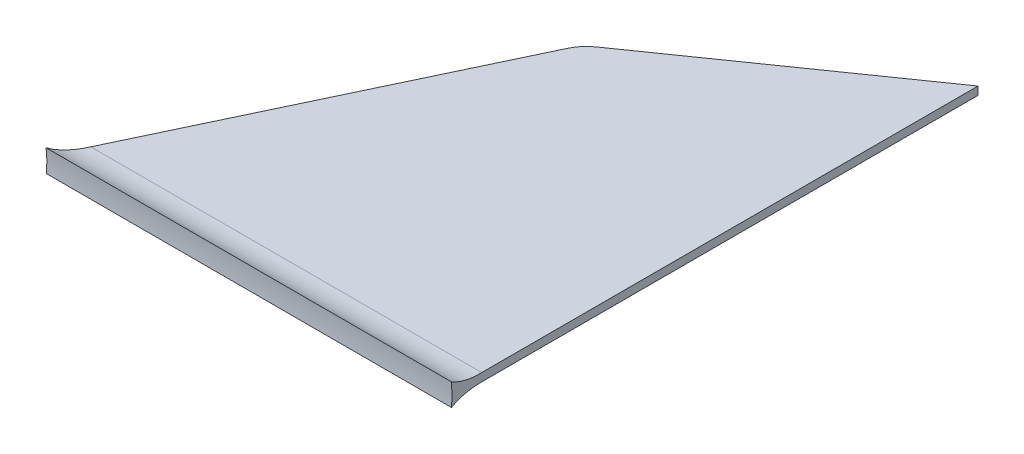
ISO-10303-21;
HEADER;
FILE_DESCRIPTION(('STEP AP214'),'2;1');
FILE_NAME('part.step','',(''),(''),'','','');
FILE_SCHEMA(('AUTOMOTIVE_DESIGN { 1 0 10303 214 1 1 1 1 }'));
ENDSEC;
DATA;
#1=APPLICATION_CONTEXT('core data for automotive mechanical design processes');
#2=APPLICATION_PROTOCOL_DEFINITION('international standard','automotive_design',2000,#1);
#3=PRODUCT_CONTEXT('',#1,'mechanical');
#4=PRODUCT('Part','Part','',(#3));
#5=PRODUCT_RELATED_PRODUCT_CATEGORY('part','',(#4));
#6=PRODUCT_DEFINITION_FORMATION('','',#4);
#7=PRODUCT_DEFINITION_CONTEXT('part definition',#1,'design');
#8=PRODUCT_DEFINITION('design','',#6,#7);
#9=PRODUCT_DEFINITION_SHAPE('','',#8);
#10=(LENGTH_UNIT() NAMED_UNIT(*) SI_UNIT(.MILLI.,.METRE.));
#11=(NAMED_UNIT(*) PLANE_ANGLE_UNIT() SI_UNIT($,.RADIAN.));
#12=(NAMED_UNIT(*) SI_UNIT($,.STERADIAN.) SOLID_ANGLE_UNIT());
#13=UNCERTAINTY_MEASURE_WITH_UNIT(LENGTH_MEASURE(1.E-05),#10,'distance_accuracy_value','');
#14=(GEOMETRIC_REPRESENTATION_CONTEXT(3) GLOBAL_UNCERTAINTY_ASSIGNED_CONTEXT((#13)) GLOBAL_UNIT_ASSIGNED_CONTEXT((#10,
#11,#12)) REPRESENTATION_CONTEXT('',''));
#15=CARTESIAN_POINT('',(0.,0.,0.));
#16=DIRECTION('',(0.,0.,1.));
#17=DIRECTION('',(1.,0.,0.));
#18=AXIS2_PLACEMENT_3D('',#15,#16,#17);
#19=CARTESIAN_POINT('',(42.5645026995307,2.,-90.));
#20=DIRECTION('',(0.903998327362129,0.,0.427535991615295));
#21=DIRECTION('',(0.427535991615295,0.,-0.903998327362129));
#22=AXIS2_PLACEMENT_3D('',#19,#20,#21);
#23=PLANE('',#22);
#24=CARTESIAN_POINT('',(3.71067552900517,0.,-7.84599317341836));
#25=CARTESIAN_POINT('',(3.58531579273385,0.000491797219638323,-7.58092778914586));
#26=CARTESIAN_POINT('',(3.45993831009392,-0.00371603010727385,-7.31582488127802));
#27=CARTESIAN_POINT('',(3.20926904675037,-0.0224615016140238,-6.78580027696923));
#28=CARTESIAN_POINT('',(3.08397733224158,-0.0370039090424223,-6.52087872049313));
#29=CARTESIAN_POINT('',(2.83320367344459,-0.077433994677133,-5.99063337847535));
#30=CARTESIAN_POINT('',(2.70772305573708,-0.103367948984552,-5.72531239790624));
#31=CARTESIAN_POINT('',(2.45736525560459,-0.167622663346544,-5.19594636323217));
#32=CARTESIAN_POINT('',(2.3324879698077,-0.205941219144582,-4.93190109055373));
#33=CARTESIAN_POINT('',(2.01796747780127,-0.319834051708501,-4.26686702495216));
#34=CARTESIAN_POINT('',(1.82889832085237,-0.404398807426178,-3.86709202357315));
#35=CARTESIAN_POINT('',(1.45463070635677,-0.608897428913534,-3.07572637453962));
#36=CARTESIAN_POINT('',(1.26942486126138,-0.728755566111489,-2.68412010637171));
#37=CARTESIAN_POINT('',(0.992767919870458,-0.940253450792282,-2.09914616926385));
#38=CARTESIAN_POINT('',(0.899284357542949,-1.01751526135691,-1.90148097700569));
#39=CARTESIAN_POINT('',(0.714101480557676,-1.18296514248587,-1.50992327348157));
#40=CARTESIAN_POINT('',(0.62240198971404,-1.27115212773291,-1.31603038968151));
#41=CARTESIAN_POINT('',(0.440748373266573,-1.4592428935537,-0.931935088588017));
#42=CARTESIAN_POINT('',(0.350803451614786,-1.55919544029076,-0.741752132480111));
#43=CARTESIAN_POINT('',(0.173416749875057,-1.77078282584916,-0.366678957790928));
#44=CARTESIAN_POINT('',(0.0859760312647441,-1.88242252792542,-0.181790983638237));
#45=CARTESIAN_POINT('',(0.,-2.,4.12687892662174E-13));
#46=B_SPLINE_CURVE_WITH_KNOTS('',3,(#24,#25,#26,#27,#28,#29,#30,#31,#32,#33,#34,#35,#36,#37,#38,
#39,#40,#41,#42,#43,#44,#45),.UNSPECIFIED.,.F.,.F.,(4,2,2,2,2,2,2,2,2,2,4),(0.,
0.879655941993665,1.75971758403859,2.6433878667751,3.52690095718426,4.87633772662082,
6.22289986694779,6.91836816277328,7.61376742543035,8.31215782638697,9.01084000525956),.UNSPECIFIED.);
#47=CARTESIAN_POINT('',(3.71067552900535,0.,-7.84599317341873));
#48=VERTEX_POINT('',#47);
#49=CARTESIAN_POINT('',(0.191540032990975,-1.75073870850016,-0.404999515461942));
#50=VERTEX_POINT('',#49);
#51=EDGE_CURVE('E126',#48,#50,#46,.T.);
#52=ORIENTED_EDGE('',*,*,#51,.T.);
#53=CARTESIAN_POINT('',(-15.1340454042778,0.732405750222965,32.0000000000004));
#54=DIRECTION('',(0.903998327362129,0.,0.427535991615295));
#55=DIRECTION('',(0.427535991615295,0.,-0.903998327362129));
#56=AXIS2_PLACEMENT_3D('',#53,#54,#55);
#57=ELLIPSE('',#56,35.9513939531672,32.5);
#58=CARTESIAN_POINT('',(0.169119053862443,3.77152673900595,-0.357591746227265));
#59=VERTEX_POINT('',#58);
#60=EDGE_CURVE('E56',#50,#59,#57,.T.);
#61=ORIENTED_EDGE('',*,*,#60,.T.);
#62=CARTESIAN_POINT('',(0.,3.99999999999989,2.02685613397344E-13));
#63=CARTESIAN_POINT('',(0.072365649543443,3.8978537676301,-0.15301267595873));
#64=CARTESIAN_POINT('',(0.14582180623743,3.79996478912292,-0.308331161625739));
#65=CARTESIAN_POINT('',(0.294671995230013,3.61269899906039,-0.623065650688167));
#66=CARTESIAN_POINT('',(0.370065606938458,3.52332035954275,-0.782480764771805));
#67=CARTESIAN_POINT('',(0.522317258909682,3.35332110937263,-1.1044074362553));
#68=CARTESIAN_POINT('',(0.599169386549027,3.27267149938144,-1.26690649177976));
#69=CARTESIAN_POINT('',(0.754363481256821,3.11965425216449,-1.59505477586288));
#70=CARTESIAN_POINT('',(0.83270552500456,3.04728704254913,-1.76070416655512));
#71=CARTESIAN_POINT('',(1.0694951200567,2.8424797659571,-2.26138107343994));
#72=CARTESIAN_POINT('',(1.22988127771266,2.7221403472804,-2.60050765248008));
#73=CARTESIAN_POINT('',(1.5545203403159,2.51155242773646,-3.28693680779158));
#74=CARTESIAN_POINT('',(1.7187805657151,2.42136676436771,-3.6342548627043));
#75=CARTESIAN_POINT('',(2.03459013466153,2.27573189552543,-4.30201460151342));
#76=CARTESIAN_POINT('',(2.18593930240007,2.21787210638783,-4.62203302608246));
#77=CARTESIAN_POINT('',(2.48989394983943,2.12306935183539,-5.26472626891561));
#78=CARTESIAN_POINT('',(2.6425000370788,2.08613718688418,-5.58740237178231));
#79=CARTESIAN_POINT('',(2.94770674656241,2.03132636599851,-6.23274302212256));
#80=CARTESIAN_POINT('',(3.10030498932871,2.01337271250511,-6.55540253833766));
#81=CARTESIAN_POINT('',(3.40552719250608,1.99444150434674,-7.20077594913203));
#82=CARTESIAN_POINT('',(3.55815092827247,1.99344475623463,-7.52348936871409));
#83=CARTESIAN_POINT('',(3.71067552900517,2.,-7.84599317341836));
#84=B_SPLINE_CURVE_WITH_KNOTS('',3,(#62,#63,#64,#65,#66,#67,#68,#69,#70,#71,#72,#73,#74,#75,#76,
#77,#78,#79,#80,#81,#82,#83),.UNSPECIFIED.,.F.,.F.,(4,2,2,2,2,2,2,2,2,2,4),(0.,
0.593000748492561,1.18587383580466,1.77671258005781,2.36758181485853,3.54796573318053,
4.73079434494676,5.8062181489395,6.88219646029566,7.95390673886503,9.02440387243802),.UNSPECIFIED.);
#85=CARTESIAN_POINT('',(3.71067552900533,2.,-7.84599317341836));
#86=VERTEX_POINT('',#85);
#87=EDGE_CURVE('E42',#59,#86,#84,.T.);
#88=ORIENTED_EDGE('',*,*,#87,.T.);
#89=DIRECTION('',(-0.427535991615295,0.,0.903998327362129));
#90=VECTOR('',#89,1.);
#91=CARTESIAN_POINT('',(42.5645026995307,2.,-90.));
#92=LINE('',#91,#90);
#93=CARTESIAN_POINT('',(41.4290446959055,2.,-87.5991445019891));
#94=VERTEX_POINT('',#93);
#95=EDGE_CURVE('E202',#94,#86,#92,.T.);
#96=ORIENTED_EDGE('',*,*,#95,.F.);
#97=DIRECTION('',(0.,-1.,0.));
#98=VECTOR('',#97,1.);
#99=CARTESIAN_POINT('',(41.4290446959055,2.,-87.5991445019891));
#100=LINE('',#99,#98);
#101=CARTESIAN_POINT('',(41.4290446959055,0.,-87.5991445019891));
#102=VERTEX_POINT('',#101);
#103=EDGE_CURVE('E211',#94,#102,#100,.T.);
#104=ORIENTED_EDGE('',*,*,#103,.T.);
#105=DIRECTION('',(-0.427535991615295,0.,0.903998327362129));
#106=VECTOR('',#105,1.);
#107=CARTESIAN_POINT('',(42.5645026995307,0.,-90.));
#108=LINE('',#107,#106);
#109=EDGE_CURVE('E198',#102,#48,#108,.T.);
#110=ORIENTED_EDGE('',*,*,#109,.T.);
#111=EDGE_LOOP('',(#52,#61,#88,#96,#104,#110));
#112=FACE_BOUND('',#111,.T.);
#113=ADVANCED_FACE('F38',(#112),#23,.F.);
#114=CARTESIAN_POINT('',(100.1,2.,0.));
#115=DIRECTION('',(-1.,0.,0.));
#116=DIRECTION('',(0.,0.,1.));
#117=AXIS2_PLACEMENT_3D('',#114,#115,#116);
#118=PLANE('',#117);
#119=CARTESIAN_POINT('',(100.1,4.,0.));
#120=CARTESIAN_POINT('',(100.1,1.90394355712191,-3.14034525511268));
#121=CARTESIAN_POINT('',(100.1,2.,-7.84599317341872));
#122=B_SPLINE_CURVE_WITH_KNOTS('',2,(#119,#120,#121),.UNSPECIFIED.,.F.,.F.,(3,3),(0.,1.),.UNSPECIFIED.);
#123=CARTESIAN_POINT('',(100.1,3.77152673900595,-0.357591746227633));
#124=VERTEX_POINT('',#123);
#125=CARTESIAN_POINT('',(100.1,2.,-7.84599317341872));
#126=VERTEX_POINT('',#125);
#127=EDGE_CURVE('E113',#124,#126,#122,.T.);
#128=ORIENTED_EDGE('',*,*,#127,.F.);
#129=CARTESIAN_POINT('',(100.1,0.732405750222965,32.));
#130=DIRECTION('',(1.,0.,0.));
#131=DIRECTION('',(0.,0.,-1.));
#132=AXIS2_PLACEMENT_3D('',#129,#130,#131);
#133=CIRCLE('',#132,32.5);
#134=CARTESIAN_POINT('',(100.1,-1.75073870850016,-0.404999515462315));
#135=VERTEX_POINT('',#134);
#136=EDGE_CURVE('E99',#135,#124,#133,.T.);
#137=ORIENTED_EDGE('',*,*,#136,.F.);
#138=CARTESIAN_POINT('',(100.1,0.,-7.84599317341872));
#139=CARTESIAN_POINT('',(100.1,0.00905307742715817,-3.10690861136602));
#140=CARTESIAN_POINT('',(100.1,-2.,0.));
#141=B_SPLINE_CURVE_WITH_KNOTS('',2,(#138,#139,#140),.UNSPECIFIED.,.F.,.F.,(3,3),(0.,1.),.UNSPECIFIED.);
#142=CARTESIAN_POINT('',(100.1,0.,-7.84599317341872));
#143=VERTEX_POINT('',#142);
#144=EDGE_CURVE('E116',#143,#135,#141,.T.);
#145=ORIENTED_EDGE('',*,*,#144,.F.);
#146=DIRECTION('',(0.,0.,-1.));
#147=VECTOR('',#146,1.);
#148=CARTESIAN_POINT('',(100.1,0.,0.));
#149=LINE('',#148,#147);
#150=CARTESIAN_POINT('',(100.1,0.,-130.2));
#151=VERTEX_POINT('',#150);
#152=EDGE_CURVE('E192',#143,#151,#149,.T.);
#153=ORIENTED_EDGE('',*,*,#152,.T.);
#154=DIRECTION('',(0.,-1.,0.));
#155=VECTOR('',#154,1.);
#156=CARTESIAN_POINT('',(100.1,2.,-130.2));
#157=LINE('',#156,#155);
#158=CARTESIAN_POINT('',(100.1,2.,-130.2));
#159=VERTEX_POINT('',#158);
#160=EDGE_CURVE('E208',#159,#151,#157,.T.);
#161=ORIENTED_EDGE('',*,*,#160,.F.);
#162=DIRECTION('',(0.,0.,-1.));
#163=VECTOR('',#162,1.);
#164=CARTESIAN_POINT('',(100.1,2.,0.));
#165=LINE('',#164,#163);
#166=EDGE_CURVE('E121',#126,#159,#165,.T.);
#167=ORIENTED_EDGE('',*,*,#166,.F.);
#168=EDGE_LOOP('',(#128,#137,#145,#153,#161,#167));
#169=FACE_BOUND('',#168,.T.);
#170=ADVANCED_FACE('F119',(#169),#118,.F.);
#171=CARTESIAN_POINT('',(100.1,2.,-130.2));
#172=DIRECTION('',(0.572746425707778,0.,0.81973259776525));
#173=DIRECTION('',(0.81973259776525,0.,-0.572746425707778));
#174=AXIS2_PLACEMENT_3D('',#171,#172,#173);
#175=PLANE('',#174);
#176=DIRECTION('',(-0.81973259776525,0.,0.572746425707778));
#177=VECTOR('',#176,1.);
#178=CARTESIAN_POINT('',(100.1,0.,-130.2));
#179=LINE('',#178,#177);
#180=CARTESIAN_POINT('',(44.741563712449,0.,-91.5211105634887));
#181=VERTEX_POINT('',#180);
#182=EDGE_CURVE('E195',#151,#181,#179,.T.);
#183=ORIENTED_EDGE('',*,*,#182,.T.);
#184=DIRECTION('',(0.,-1.,0.));
#185=VECTOR('',#184,1.);
#186=CARTESIAN_POINT('',(44.741563712449,2.,-91.5211105634887));
#187=LINE('',#186,#185);
#188=CARTESIAN_POINT('',(44.741563712449,2.,-91.5211105634887));
#189=VERTEX_POINT('',#188);
#190=EDGE_CURVE('E63',#181,#189,#187,.F.);
#191=ORIENTED_EDGE('',*,*,#190,.T.);
#192=DIRECTION('',(-0.81973259776525,0.,0.572746425707778));
#193=VECTOR('',#192,1.);
#194=CARTESIAN_POINT('',(100.1,2.,-130.2));
#195=LINE('',#194,#193);
#196=EDGE_CURVE('E206',#159,#189,#195,.T.);
#197=ORIENTED_EDGE('',*,*,#196,.F.);
#198=ORIENTED_EDGE('',*,*,#160,.T.);
#199=EDGE_LOOP('',(#183,#191,#197,#198));
#200=FACE_BOUND('',#199,.T.);
#201=ADVANCED_FACE('F178',(#200),#175,.F.);
#202=CARTESIAN_POINT('',(0.,2.,0.));
#203=DIRECTION('',(0.,1.,0.));
#204=DIRECTION('',(0.,0.,1.));
#205=AXIS2_PLACEMENT_3D('',#202,#203,#204);
#206=PLANE('',#205);
#207=DIRECTION('',(-1.,0.,0.));
#208=VECTOR('',#207,1.);
#209=CARTESIAN_POINT('',(0.,2.,-7.84599317341873));
#210=LINE('',#209,#208);
#211=EDGE_CURVE('E204',#126,#86,#210,.T.);
#212=ORIENTED_EDGE('',*,*,#211,.F.);
#213=ORIENTED_EDGE('',*,*,#166,.T.);
#214=ORIENTED_EDGE('',*,*,#196,.T.);
#215=CARTESIAN_POINT('',(50.4690279695268,2.,-83.3237845858362));
#216=DIRECTION('',(0.,1.,0.));
#217=DIRECTION('',(0.,0.,1.));
#218=AXIS2_PLACEMENT_3D('',#215,#216,#217);
#219=CIRCLE('',#218,10.);
#220=EDGE_CURVE('E220',#189,#94,#219,.T.);
#221=ORIENTED_EDGE('',*,*,#220,.T.);
#222=ORIENTED_EDGE('',*,*,#95,.T.);
#223=EDGE_LOOP('',(#212,#213,#214,#221,#222));
#224=FACE_BOUND('',#223,.T.);
#225=ADVANCED_FACE('F155',(#224),#206,.T.);
#226=CARTESIAN_POINT('',(0.,0.,0.));
#227=DIRECTION('',(0.,1.,0.));
#228=DIRECTION('',(0.,0.,1.));
#229=AXIS2_PLACEMENT_3D('',#226,#227,#228);
#230=PLANE('',#229);
#231=ORIENTED_EDGE('',*,*,#152,.F.);
#232=DIRECTION('',(-1.,0.,0.));
#233=VECTOR('',#232,1.);
#234=CARTESIAN_POINT('',(0.,0.,-7.84599317341873));
#235=LINE('',#234,#233);
#236=EDGE_CURVE('E49',#143,#48,#235,.T.);
#237=ORIENTED_EDGE('',*,*,#236,.T.);
#238=ORIENTED_EDGE('',*,*,#109,.F.);
#239=CARTESIAN_POINT('',(50.4690279695268,0.,-83.3237845858362));
#240=DIRECTION('',(0.,1.,0.));
#241=DIRECTION('',(0.,0.,1.));
#242=AXIS2_PLACEMENT_3D('',#239,#240,#241);
#243=CIRCLE('',#242,10.);
#244=EDGE_CURVE('E215',#102,#181,#243,.F.);
#245=ORIENTED_EDGE('',*,*,#244,.T.);
#246=ORIENTED_EDGE('',*,*,#182,.F.);
#247=EDGE_LOOP('',(#231,#237,#238,#245,#246));
#248=FACE_BOUND('',#247,.T.);
#249=ADVANCED_FACE('F180',(#248),#230,.F.);
#250=CARTESIAN_POINT('',(50.4690279695268,2.,-83.3237845858362));
#251=DIRECTION('',(0.,-1.,0.));
#252=DIRECTION('',(0.,0.,-1.));
#253=AXIS2_PLACEMENT_3D('',#250,#251,#252);
#254=CYLINDRICAL_SURFACE('',#253,10.);
#255=ORIENTED_EDGE('',*,*,#220,.F.);
#256=ORIENTED_EDGE('',*,*,#190,.F.);
#257=ORIENTED_EDGE('',*,*,#244,.F.);
#258=ORIENTED_EDGE('',*,*,#103,.F.);
#259=EDGE_LOOP('',(#255,#256,#257,#258));
#260=FACE_BOUND('',#259,.T.);
#261=ADVANCED_FACE('F40',(#260),#254,.T.);
#262=CARTESIAN_POINT('',(-5.90000000000007,4.,3.99626121089303E-13));
#263=CARTESIAN_POINT('',(-5.90000000000009,1.90394355712191,-3.14034525511229));
#264=CARTESIAN_POINT('',(-5.9000000000001,2.,-7.84599317341833));
#265=B_SPLINE_CURVE_WITH_KNOTS('',2,(#262,#263,#264),.UNSPECIFIED.,.F.,.F.,(3,3),(0.,1.),.UNSPECIFIED.);
#266=DIRECTION('',(1.,0.,0.));
#267=VECTOR('',#266,1.);
#268=SURFACE_OF_LINEAR_EXTRUSION('',#265,#267);
#269=ORIENTED_EDGE('',*,*,#87,.F.);
#270=DIRECTION('',(1.,0.,0.));
#271=VECTOR('',#270,1.);
#272=CARTESIAN_POINT('',(49.7497,3.77152673900595,-0.35759174622745));
#273=LINE('',#272,#271);
#274=EDGE_CURVE('E102',#59,#124,#273,.T.);
#275=ORIENTED_EDGE('',*,*,#274,.T.);
#276=ORIENTED_EDGE('',*,*,#127,.T.);
#277=ORIENTED_EDGE('',*,*,#211,.T.);
#278=EDGE_LOOP('',(#269,#275,#276,#277));
#279=FACE_BOUND('',#278,.T.);
#280=ADVANCED_FACE('F111',(#279),#268,.F.);
#281=CARTESIAN_POINT('',(-5.9000000000001,0.,-7.84599317341832));
#282=CARTESIAN_POINT('',(-5.90000000000009,0.00905307742715817,-3.10690861136562));
#283=CARTESIAN_POINT('',(-5.90000000000007,-2.,3.96132213055454E-13));
#284=B_SPLINE_CURVE_WITH_KNOTS('',2,(#281,#282,#283),.UNSPECIFIED.,.F.,.F.,(3,3),(0.,1.),.UNSPECIFIED.);
#285=DIRECTION('',(1.,0.,0.));
#286=VECTOR('',#285,1.);
#287=SURFACE_OF_LINEAR_EXTRUSION('',#284,#286);
#288=ORIENTED_EDGE('',*,*,#144,.T.);
#289=DIRECTION('',(1.,0.,0.));
#290=VECTOR('',#289,1.);
#291=CARTESIAN_POINT('',(49.7496999999999,-1.75073870850016,-0.404999515462123));
#292=LINE('',#291,#290);
#293=EDGE_CURVE('E11',#135,#50,#292,.F.);
#294=ORIENTED_EDGE('',*,*,#293,.T.);
#295=ORIENTED_EDGE('',*,*,#51,.F.);
#296=ORIENTED_EDGE('',*,*,#236,.F.);
#297=EDGE_LOOP('',(#288,#294,#295,#296));
#298=FACE_BOUND('',#297,.T.);
#299=ADVANCED_FACE('F147',(#298),#287,.F.);
#300=CARTESIAN_POINT('',(-5.89999999999995,0.732405750222965,32.0000000000004));
#301=DIRECTION('',(1.,0.,0.));
#302=DIRECTION('',(0.,0.,-1.));
#303=AXIS2_PLACEMENT_3D('',#300,#301,#302);
#304=CYLINDRICAL_SURFACE('',#303,32.5);
#305=ORIENTED_EDGE('',*,*,#60,.F.);
#306=ORIENTED_EDGE('',*,*,#293,.F.);
#307=ORIENTED_EDGE('',*,*,#136,.T.);
#308=ORIENTED_EDGE('',*,*,#274,.F.);
#309=EDGE_LOOP('',(#305,#306,#307,#308));
#310=FACE_BOUND('',#309,.T.);
#311=ADVANCED_FACE('F101',(#310),#304,.F.);
#312=CLOSED_SHELL('',(#113,#170,#201,#225,#249,#261,#280,#299,#311));
#313=MANIFOLD_SOLID_BREP('B2',#312);
#314=ADVANCED_BREP_SHAPE_REPRESENTATION('',(#18,#313),#14);
#315=SHAPE_DEFINITION_REPRESENTATION(#9,#314);
ENDSEC;
END-ISO-10303-21;
